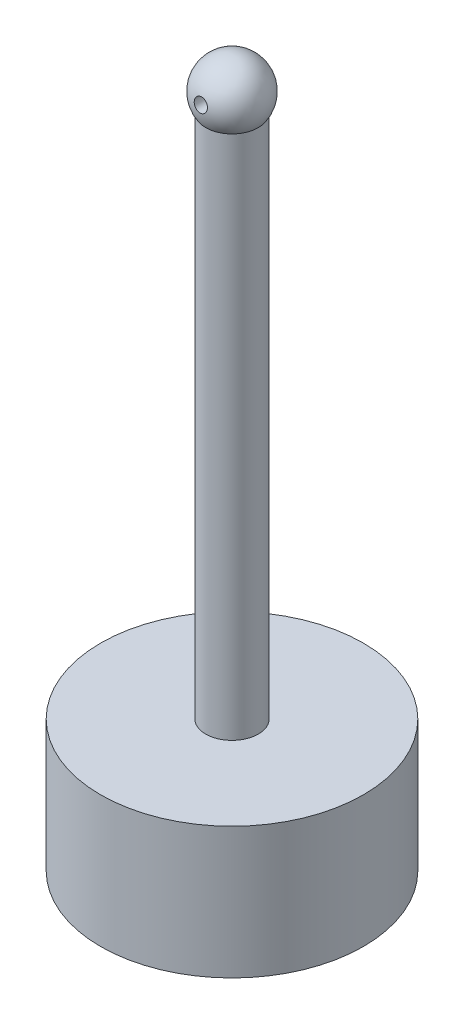
ISO-10303-21;
HEADER;
FILE_DESCRIPTION(('STEP AP214'),'2;1');
FILE_NAME('part.step','',(''),(''),'','','');
FILE_SCHEMA(('AUTOMOTIVE_DESIGN { 1 0 10303 214 1 1 1 1 }'));
ENDSEC;
DATA;
#1=APPLICATION_CONTEXT('core data for automotive mechanical design processes');
#2=APPLICATION_PROTOCOL_DEFINITION('international standard','automotive_design',2000,#1);
#3=PRODUCT_CONTEXT('',#1,'mechanical');
#4=PRODUCT('Part','Part','',(#3));
#5=PRODUCT_RELATED_PRODUCT_CATEGORY('part','',(#4));
#6=PRODUCT_DEFINITION_FORMATION('','',#4);
#7=PRODUCT_DEFINITION_CONTEXT('part definition',#1,'design');
#8=PRODUCT_DEFINITION('design','',#6,#7);
#9=PRODUCT_DEFINITION_SHAPE('','',#8);
#10=(LENGTH_UNIT() NAMED_UNIT(*) SI_UNIT(.MILLI.,.METRE.));
#11=(NAMED_UNIT(*) PLANE_ANGLE_UNIT() SI_UNIT($,.RADIAN.));
#12=(NAMED_UNIT(*) SI_UNIT($,.STERADIAN.) SOLID_ANGLE_UNIT());
#13=UNCERTAINTY_MEASURE_WITH_UNIT(LENGTH_MEASURE(1.E-05),#10,'distance_accuracy_value','');
#14=(GEOMETRIC_REPRESENTATION_CONTEXT(3) GLOBAL_UNCERTAINTY_ASSIGNED_CONTEXT((#13)) GLOBAL_UNIT_ASSIGNED_CONTEXT((#10,
#11,#12)) REPRESENTATION_CONTEXT('',''));
#15=CARTESIAN_POINT('',(0.,0.,0.));
#16=DIRECTION('',(0.,0.,1.));
#17=DIRECTION('',(1.,0.,0.));
#18=AXIS2_PLACEMENT_3D('',#15,#16,#17);
#19=CARTESIAN_POINT('',(0.,2568.17122246381,0.));
#20=DIRECTION('',(0.,1.,0.));
#21=DIRECTION('',(1.,0.,0.));
#22=AXIS2_PLACEMENT_3D('',#19,#20,#21);
#23=SPHERICAL_SURFACE('',#22,122.029891086168);
#24=CARTESIAN_POINT('',(0.,2498.23343354751,0.));
#25=DIRECTION('',(0.,0.999999999999998,0.));
#26=DIRECTION('',(0.,0.,1.));
#27=AXIS2_PLACEMENT_3D('',#24,#25,#26);
#28=CIRCLE('',#27,100.);
#29=CARTESIAN_POINT('',(0.,2498.23343354751,100.));
#30=VERTEX_POINT('',#29);
#31=EDGE_CURVE('E10',#30,#30,#28,.T.);
#32=ORIENTED_EDGE('',*,*,#31,.T.);
#33=EDGE_LOOP('',(#32));
#34=FACE_BOUND('',#33,.T.);
#35=CARTESIAN_POINT('',(-18.0432192767881,2565.21995179091,120.652503322753));
#36=CARTESIAN_POINT('',(-17.5593675486618,2564.71543328241,120.712522142687));
#37=CARTESIAN_POINT('',(-17.0542574905268,2564.23113976605,120.770090122937));
#38=CARTESIAN_POINT('',(-16.0047309310861,2563.30618718758,120.87996772107));
#39=CARTESIAN_POINT('',(-15.4603048199151,2562.86553885633,120.932276045831));
#40=CARTESIAN_POINT('',(-14.3354952907405,2562.03082488183,121.031305502747));
#41=CARTESIAN_POINT('',(-13.7550751582116,2561.63680803541,121.078020782727));
#42=CARTESIAN_POINT('',(-12.5628855367983,2560.89877934475,121.165478414951));
#43=CARTESIAN_POINT('',(-11.9511179997832,2560.55476439222,121.206221138473));
#44=CARTESIAN_POINT('',(-10.7006420049655,2559.91930651498,121.281448132893));
#45=CARTESIAN_POINT('',(-10.0619387864986,2559.62785342398,121.315933614049));
#46=CARTESIAN_POINT('',(-8.76200165065304,2559.09958743673,121.378417725583));
#47=CARTESIAN_POINT('',(-8.10076738507192,2558.86277538535,121.406416255658));
#48=CARTESIAN_POINT('',(-6.76065817125818,2558.44560826033,121.455725331318));
#49=CARTESIAN_POINT('',(-6.08178761005979,2558.26523928936,121.477037523206));
#50=CARTESIAN_POINT('',(-4.71111020291278,2557.96222427755,121.512835014058));
#51=CARTESIAN_POINT('',(-4.01930344452943,2557.83957784613,121.527320359214));
#52=CARTESIAN_POINT('',(-2.63036790872094,2557.65327845591,121.54932147659));
#53=CARTESIAN_POINT('',(-1.93326944830853,2557.58940252448,121.556863591177));
#54=CARTESIAN_POINT('',(-0.536131263268105,2557.52031645951,121.56502082721));
#55=CARTESIAN_POINT('',(0.16390845656835,2557.51510623045,121.565635959936));
#56=CARTESIAN_POINT('',(1.56194634926557,2557.56339074981,121.559934922455));
#57=CARTESIAN_POINT('',(2.25994447892242,2557.61688673169,121.553618606614));
#58=CARTESIAN_POINT('',(3.64890372527966,2557.78218810302,121.534098146146));
#59=CARTESIAN_POINT('',(4.33986484687952,2557.89399345187,121.520894006315));
#60=CARTESIAN_POINT('',(5.70850348452919,2558.17481205051,121.487721302184));
#61=CARTESIAN_POINT('',(6.38620407397663,2558.34371441939,121.467765848699));
#62=CARTESIAN_POINT('',(7.72489430424842,2558.73753123251,121.421221919458));
#63=CARTESIAN_POINT('',(8.38588397732627,2558.96244556863,121.394633456506));
#64=CARTESIAN_POINT('',(9.68649277821817,2559.46663432533,121.335005907096));
#65=CARTESIAN_POINT('',(10.3261118994395,2559.74590876266,121.301966818647));
#66=CARTESIAN_POINT('',(11.5794916151916,2560.35677558558,121.229664077206));
#67=CARTESIAN_POINT('',(12.1932521422995,2560.68836810756,121.190400407985));
#68=CARTESIAN_POINT('',(13.3921014790321,2561.4023351902,121.105812557731));
#69=CARTESIAN_POINT('',(13.9771161496911,2561.78483250098,121.060473725387));
#70=CARTESIAN_POINT('',(15.1127752133339,2562.59719774416,120.964120014855));
#71=CARTESIAN_POINT('',(15.6634195779036,2563.02706571573,120.913105131975));
#72=CARTESIAN_POINT('',(16.7265348696274,2563.9310754608,120.805745949197));
#73=CARTESIAN_POINT('',(17.2390051442195,2564.40521799082,120.749401558232));
#74=CARTESIAN_POINT('',(18.2222400110106,2565.39436959453,120.631766687878));
#75=CARTESIAN_POINT('',(18.693004425244,2565.90937884257,120.570476187386));
#76=CARTESIAN_POINT('',(19.5922243887948,2566.97970176305,120.442994017191));
#77=CARTESIAN_POINT('',(20.0204177803516,2567.53523254414,120.376775900995));
#78=CARTESIAN_POINT('',(20.8284256665978,2568.67994784338,120.240208260145));
#79=CARTESIAN_POINT('',(21.2082400006927,2569.26913247324,120.169858721776));
#80=CARTESIAN_POINT('',(21.9169155114928,2570.47698183128,120.025506077028));
#81=CARTESIAN_POINT('',(22.245775224914,2571.0956474054,119.951502865805));
#82=CARTESIAN_POINT('',(22.8503071708509,2572.35807051904,119.800348895419));
#83=CARTESIAN_POINT('',(23.125979179581,2573.00182816411,119.723198123014));
#84=CARTESIAN_POINT('',(23.6239769163186,2574.31437217636,119.565739344046));
#85=CARTESIAN_POINT('',(23.8459262088705,2574.98329923742,119.485413401293));
#86=CARTESIAN_POINT('',(24.2325314087254,2576.33726001248,119.322658653403));
#87=CARTESIAN_POINT('',(24.3971870596266,2577.02229379855,119.240229838855));
#88=CARTESIAN_POINT('',(24.6681007510405,2578.40364741125,119.073838096113));
#89=CARTESIAN_POINT('',(24.7743573082847,2579.09996752408,118.989875129009));
#90=CARTESIAN_POINT('',(24.927756488301,2580.49897482228,118.821000328739));
#91=CARTESIAN_POINT('',(24.9748989692401,2581.20166202292,118.736088493299));
#92=CARTESIAN_POINT('',(25.009844499885,2582.61195634843,118.565486166993));
#93=CARTESIAN_POINT('',(24.997352203525,2583.31957059359,118.479793902819));
#94=CARTESIAN_POINT('',(24.9124407012151,2584.73122639777,118.308656524195));
#95=CARTESIAN_POINT('',(24.8400212669149,2585.43526794316,118.223211410689));
#96=CARTESIAN_POINT('',(24.6357507083108,2586.83479075638,118.053177232188));
#97=CARTESIAN_POINT('',(24.5038988348375,2587.53027191618,117.968588177999));
#98=CARTESIAN_POINT('',(24.1816643511118,2588.90772090249,117.800876025069));
#99=CARTESIAN_POINT('',(23.9912817765551,2589.58968873723,117.717752925433));
#100=CARTESIAN_POINT('',(23.5530978922276,2590.93583377831,117.55350518137));
#101=CARTESIAN_POINT('',(23.3052469735394,2591.59999505752,117.472382330958));
#102=CARTESIAN_POINT('',(22.7539197323655,2592.90514999279,117.31280619947));
#103=CARTESIAN_POINT('',(22.4504433275293,2593.54614361455,117.234352922345));
#104=CARTESIAN_POINT('',(21.7899626695606,2594.80033711545,117.080699969027));
#105=CARTESIAN_POINT('',(21.4329588379389,2595.41353721342,117.005500267221));
#106=CARTESIAN_POINT('',(20.6679000737382,2596.60770078243,116.858919761533));
#107=CARTESIAN_POINT('',(20.2598453268669,2597.18866437073,116.787538943761));
#108=CARTESIAN_POINT('',(19.3971804383724,2598.31197248311,116.649403113007));
#109=CARTESIAN_POINT('',(18.9427532849795,2598.85445549822,116.58263153746));
#110=CARTESIAN_POINT('',(17.9892372919571,2599.89926238892,116.453928584802));
#111=CARTESIAN_POINT('',(17.4901485262185,2600.40158633094,116.391997199685));
#112=CARTESIAN_POINT('',(16.4508338242067,2601.36236785603,116.273456010125));
#113=CARTESIAN_POINT('',(15.9106089575461,2601.82082657896,116.216846067401));
#114=CARTESIAN_POINT('',(14.7928408354136,2602.69049316018,116.109389970985));
#115=CARTESIAN_POINT('',(14.2152977728871,2603.10170126274,116.058543787496));
#116=CARTESIAN_POINT('',(13.0311413568527,2603.87111800384,115.963349734778));
#117=CARTESIAN_POINT('',(12.4247573792034,2604.22967441299,115.918959245631));
#118=CARTESIAN_POINT('',(11.1835562075918,2604.89450331759,115.836610641709));
#119=CARTESIAN_POINT('',(10.5487391333217,2605.2007760331,115.798652499861));
#120=CARTESIAN_POINT('',(9.2552246284625,2605.75874225146,115.729472480618));
#121=CARTESIAN_POINT('',(8.59652797191249,2606.01043752155,115.698250385106));
#122=CARTESIAN_POINT('',(7.25996550948709,2606.45737084011,115.642792083656));
#123=CARTESIAN_POINT('',(6.58209978508714,2606.6526091285,115.618555848029));
#124=CARTESIAN_POINT('',(5.2168456185483,2606.9840023313,115.577408661085));
#125=CARTESIAN_POINT('',(4.52955584834893,2607.12055768981,115.560448063293));
#126=CARTESIAN_POINT('',(3.14580492102509,2607.33552100776,115.533745568516));
#127=CARTESIAN_POINT('',(2.44934380857262,2607.41392925031,115.524003636382));
#128=CARTESIAN_POINT('',(1.05225036448843,2607.51201078123,115.511816983512));
#129=CARTESIAN_POINT('',(0.351618126937429,2607.53168538936,115.509372098809));
#130=CARTESIAN_POINT('',(-1.04881239127217,2607.51215593088,115.511798792589));
#131=CARTESIAN_POINT('',(-1.74861067300749,2607.47295194037,115.516670361615));
#132=CARTESIAN_POINT('',(-3.13978968613947,2607.3362121141,115.533659246523));
#133=CARTESIAN_POINT('',(-3.83119192916193,2607.23889168573,115.545749805343));
#134=CARTESIAN_POINT('',(-5.20328033287274,2606.98682065302,115.577057901585));
#135=CARTESIAN_POINT('',(-5.88396652796882,2606.83207023314,115.596275416119));
#136=CARTESIAN_POINT('',(-7.22980144769515,2606.46628589758,115.641684474535));
#137=CARTESIAN_POINT('',(-7.8949502373459,2606.25525221749,115.667875989226));
#138=CARTESIAN_POINT('',(-9.20502359159855,2605.77845726793,115.727025939732));
#139=CARTESIAN_POINT('',(-9.84994811297057,2605.51269588148,115.759984390009));
#140=CARTESIAN_POINT('',(-11.1158672618488,2604.92801663481,115.832456334756));
#141=CARTESIAN_POINT('',(-11.736829771532,2604.60903028619,115.871978274628));
#142=CARTESIAN_POINT('',(-12.949596555246,2603.92047651409,115.957238450586));
#143=CARTESIAN_POINT('',(-13.5414008306574,2603.550909093,116.002976686378));
#144=CARTESIAN_POINT('',(-14.691751414592,2602.76387030226,116.100316692785));
#145=CARTESIAN_POINT('',(-15.2502970979519,2602.34639803257,116.151918573566));
#146=CARTESIAN_POINT('',(-16.330267425742,2601.46656549637,116.260590422944));
#147=CARTESIAN_POINT('',(-16.8516919060858,2601.00420503145,116.317660415709));
#148=CARTESIAN_POINT('',(-17.8566717715983,2600.03518370395,116.437172492605));
#149=CARTESIAN_POINT('',(-18.3399974242679,2599.52828808377,116.499643012878));
#150=CARTESIAN_POINT('',(-19.2621752394435,2598.47609073167,116.629205039442));
#151=CARTESIAN_POINT('',(-19.7010272656551,2597.93078888205,116.696296559893));
#152=CARTESIAN_POINT('',(-20.5312766683457,2596.80565033786,116.834601662941));
#153=CARTESIAN_POINT('',(-20.9226725750813,2596.22581257452,116.905815373104));
#154=CARTESIAN_POINT('',(-21.6553430113817,2595.03572230039,117.051837679961));
#155=CARTESIAN_POINT('',(-21.9966173077945,2594.42546964813,117.126646293376));
#156=CARTESIAN_POINT('',(-22.6290642547674,2593.17425422202,117.279874949308));
#157=CARTESIAN_POINT('',(-22.9198499503284,2592.53309858912,117.358317506847));
#158=CARTESIAN_POINT('',(-23.4462499537283,2591.22882849294,117.51772377006));
#159=CARTESIAN_POINT('',(-23.6818639910587,2590.56571392202,117.598687488093));
#160=CARTESIAN_POINT('',(-24.0963230094774,2589.22221659936,117.762549555038));
#161=CARTESIAN_POINT('',(-24.275168574815,2588.54183402541,117.84544788403));
#162=CARTESIAN_POINT('',(-24.5748866657495,2587.16858034,118.012586448823));
#163=CARTESIAN_POINT('',(-24.6957590806949,2586.47570920469,118.096826687184));
#164=CARTESIAN_POINT('',(-24.8792300237313,2585.07841172935,118.266528378569));
#165=CARTESIAN_POINT('',(-24.9414965895246,2584.37394229229,118.351994037101));
#166=CARTESIAN_POINT('',(-25.0061487981033,2582.96227404773,118.523070348929));
#167=CARTESIAN_POINT('',(-25.0085339566146,2582.2550752182,118.608681003392));
#168=CARTESIAN_POINT('',(-24.9533931541712,2580.84277106551,118.779464471363));
#169=CARTESIAN_POINT('',(-24.8958511922723,2580.13766635193,118.864637161829));
#170=CARTESIAN_POINT('',(-24.7212176867066,2578.73475266605,119.033921088046));
#171=CARTESIAN_POINT('',(-24.6041270741454,2578.03694357986,119.118032340373));
#172=CARTESIAN_POINT('',(-24.3108751877274,2576.65209874534,119.284782647002));
#173=CARTESIAN_POINT('',(-24.1345891464992,2575.96508898769,119.367418200221));
#174=CARTESIAN_POINT('',(-23.7241987167979,2574.60824034062,119.530458783744));
#175=CARTESIAN_POINT('',(-23.4900904372673,2573.93840261011,119.610863663533));
#176=CARTESIAN_POINT('',(-22.9659473386179,2572.62147731363,119.76878846047));
#177=CARTESIAN_POINT('',(-22.6759745153039,2571.97436546011,119.846311463063));
#178=CARTESIAN_POINT('',(-22.0420550300782,2570.7069983508,119.997998903028));
#179=CARTESIAN_POINT('',(-21.6981225387779,2570.08673609832,120.07216421561));
#180=CARTESIAN_POINT('',(-20.8598948725368,2568.71600066468,120.23591995207));
#181=CARTESIAN_POINT('',(-20.3499566432051,2567.97488927723,120.324352507404));
#182=CARTESIAN_POINT('',(-19.2528099097766,2566.55134788649,120.494042854571));
#183=CARTESIAN_POINT('',(-18.6656014766138,2565.86891782932,120.575300652989));
#184=CARTESIAN_POINT('',(-18.0432192767881,2565.21995179091,120.652503322753));
#185=B_SPLINE_CURVE_WITH_KNOTS('',3,(#35,#36,#37,#38,#39,#40,#41,#42,#43,#44,#45,#46,#47,#48,
#49,#50,#51,#52,#53,#54,#55,#56,#57,#58,#59,#60,#61,#62,#63,#64,#65,#66,#67,#68,#69,#70,#71,#72,
#73,#74,#75,#76,#77,#78,#79,#80,#81,#82,#83,#84,#85,#86,#87,#88,#89,#90,#91,#92,#93,#94,#95,#96,
#97,#98,#99,#100,#101,#102,#103,#104,#105,#106,#107,#108,#109,#110,#111,#112,#113,#114,#115,
#116,#117,#118,#119,#120,#121,#122,#123,#124,#125,#126,#127,#128,#129,#130,#131,#132,#133,#134,
#135,#136,#137,#138,#139,#140,#141,#142,#143,#144,#145,#146,#147,#148,#149,#150,#151,#152,#153,
#154,#155,#156,#157,#158,#159,#160,#161,#162,#163,#164,#165,#166,#167,#168,#169,#170,#171,#172,
#173,#174,#175,#176,#177,#178,#179,#180,#181,#182,#183,#184),.UNSPECIFIED.,.T.,.F.,(4,2,2,2,2,2,
2,2,2,2,2,2,2,2,2,2,2,2,2,2,2,2,2,2,2,2,2,2,2,2,2,2,2,2,2,2,2,2,2,2,2,2,2,2,2,2,2,2,2,2,2,2,2,2,
2,2,2,2,2,2,2,2,2,2,2,2,2,2,2,2,2,2,2,2,4),(0.,2.10404484756952,4.2086057305105,
6.31534978373943,8.42196281802293,10.5281679621254,12.634405671023,14.7401243766279,
16.8458288337557,18.9435109973664,21.0411897449974,23.1389125668951,25.2366339281723,
27.3303047507174,29.42397153199,31.5176389591452,33.6113118449331,35.7101280509151,
37.8089459919719,39.9077998027748,42.006662569299,44.117739586023,46.2288236102921,
48.3399682481693,50.4511217684367,52.5766656532962,54.7022190503137,56.8278264314042,
58.9534389124752,61.0895895518729,63.2257483310389,65.3619340380826,67.498118442352,
69.636153795288,71.7741923135018,73.9122139962571,76.0502279017626,78.1801093712463,
80.3099873169947,82.4398099009853,84.5696214740845,86.6846629817107,88.7996955866792,
90.9146596956139,93.0296148165414,95.12989931921,97.2301735955429,99.3304006778295,
101.430625045545,103.523112874477,105.615593983355,107.708066334109,109.800543157269,
111.895733583922,113.990923911358,116.086153609751,118.181392569089,120.288427817353,
122.395469522668,124.50257646762,126.609693213943,128.732307643796,130.854932480678,
132.977535471242,135.100142513136,137.234701577956,139.369277905426,141.504424325291,
143.639537360928,145.779179162589,147.918964987362,150.056389718009,152.19325406582,
154.89970562272,157.606154695111),.UNSPECIFIED.);
#186=CARTESIAN_POINT('',(-18.0432192767881,2565.21995179091,120.652503322753));
#187=VERTEX_POINT('',#186);
#188=EDGE_CURVE('E64',#187,#187,#185,.T.);
#189=ORIENTED_EDGE('',*,*,#188,.F.);
#190=EDGE_LOOP('',(#189));
#191=FACE_BOUND('',#190,.T.);
#192=CARTESIAN_POINT('',(-18.0432192767881,2565.21995179091,-120.652503322753));
#193=CARTESIAN_POINT('',(-18.5319061895835,2565.72949733367,-120.591886490275));
#194=CARTESIAN_POINT('',(-18.9987941193725,2566.25955179517,-120.528784149022));
#195=CARTESIAN_POINT('',(-19.8859744136449,2567.35708451066,-120.3980138987));
#196=CARTESIAN_POINT('',(-20.3062536355464,2567.9245732487,-120.330344710492));
#197=CARTESIAN_POINT('',(-21.09758036842,2569.09338650886,-120.190846630914));
#198=CARTESIAN_POINT('',(-21.4685691737407,2569.69475018453,-120.119012923162));
#199=CARTESIAN_POINT('',(-22.1581552410256,2570.92632607122,-119.971760545563));
#200=CARTESIAN_POINT('',(-22.4767562052426,2571.55653623963,-119.896342129534));
#201=CARTESIAN_POINT('',(-23.0592045634784,2572.84086404711,-119.74249288117));
#202=CARTESIAN_POINT('',(-23.3230908341298,2573.4949643201,-119.664064234988));
#203=CARTESIAN_POINT('',(-23.7946059133438,2574.82284884111,-119.504684732986));
#204=CARTESIAN_POINT('',(-24.0022338139599,2575.49663340661,-119.423733836483));
#205=CARTESIAN_POINT('',(-24.3597758175698,2576.85892022812,-119.259892849851));
#206=CARTESIAN_POINT('',(-24.5097051350964,2577.54741855363,-119.177003277056));
#207=CARTESIAN_POINT('',(-24.7509206982353,2578.93444409765,-119.00983907633));
#208=CARTESIAN_POINT('',(-24.8422070077754,2579.63297130522,-118.92556444991));
#209=CARTESIAN_POINT('',(-24.965780117809,2581.03801169323,-118.755869272259));
#210=CARTESIAN_POINT('',(-24.9978239458759,2581.74454585649,-118.670445442902));
#211=CARTESIAN_POINT('',(-25.0019617539314,2583.1577666991,-118.499393839132));
#212=CARTESIAN_POINT('',(-24.9740555104654,2583.86445337901,-118.413766063961));
#213=CARTESIAN_POINT('',(-24.8584840598299,2585.2730140678,-118.242908830179));
#214=CARTESIAN_POINT('',(-24.7708154049617,2585.97488779666,-118.157679394834));
#215=CARTESIAN_POINT('',(-24.5363151130631,2587.36880582282,-117.98823259464));
#216=CARTESIAN_POINT('',(-24.3894834677216,2588.06085011874,-117.904015229933));
#217=CARTESIAN_POINT('',(-24.0373570011975,2589.43136957091,-117.737055966757));
#218=CARTESIAN_POINT('',(-23.8319623384842,2590.10981941814,-117.654316846689));
#219=CARTESIAN_POINT('',(-23.3642202103055,2591.4470734137,-117.491066538902));
#220=CARTESIAN_POINT('',(-23.1018726338911,2592.10587752376,-117.410555355523));
#221=CARTESIAN_POINT('',(-22.5220319568448,2593.39910332694,-117.252355360074));
#222=CARTESIAN_POINT('',(-22.2045391832381,2594.03352516464,-117.174666531269));
#223=CARTESIAN_POINT('',(-21.5166027597688,2595.27340769461,-117.022690497712));
#224=CARTESIAN_POINT('',(-21.1461592754564,2595.87886847742,-116.948403282325));
#225=CARTESIAN_POINT('',(-20.3560804377527,2597.05467031726,-116.804007341071));
#226=CARTESIAN_POINT('',(-19.9365953285637,2597.6251108767,-116.733886796646));
#227=CARTESIAN_POINT('',(-19.0504701824606,2598.72868248338,-116.59811712947));
#228=CARTESIAN_POINT('',(-18.5838301962115,2599.26181357071,-116.532468001915));
#229=CARTESIAN_POINT('',(-17.6066788622592,2600.28684608986,-116.40614783331));
#230=CARTESIAN_POINT('',(-17.0961686238043,2600.77874856351,-116.345476666468));
#231=CARTESIAN_POINT('',(-16.0348730792565,2601.71770506799,-116.229583221944));
#232=CARTESIAN_POINT('',(-15.4840879769058,2602.16475932567,-116.174360916701));
#233=CARTESIAN_POINT('',(-14.3498961493034,2603.00791856394,-116.070143253399));
#234=CARTESIAN_POINT('',(-13.7667270151626,2603.4043384101,-116.021109438033));
#235=CARTESIAN_POINT('',(-12.5686354505829,2604.14670133702,-115.929234346255));
#236=CARTESIAN_POINT('',(-11.9537131422265,2604.49264461183,-115.886393046036));
#237=CARTESIAN_POINT('',(-10.6965160659388,2605.13146707179,-115.807244562531));
#238=CARTESIAN_POINT('',(-10.0542421509192,2605.42434791011,-115.770937175679));
#239=CARTESIAN_POINT('',(-8.74693038926791,2605.95486179275,-115.705146075274));
#240=CARTESIAN_POINT('',(-8.08189264752608,2606.1924950916,-115.675662330284));
#241=CARTESIAN_POINT('',(-6.73870764973599,2606.60921588666,-115.623943682374));
#242=CARTESIAN_POINT('',(-6.0606893333349,2606.78871277739,-115.601658093493));
#243=CARTESIAN_POINT('',(-4.69178352399177,2607.09014754836,-115.564225826869));
#244=CARTESIAN_POINT('',(-4.00089609447439,2607.2120857122,-115.549079113951));
#245=CARTESIAN_POINT('',(-2.61121781060879,2607.3974877984,-115.526046780402));
#246=CARTESIAN_POINT('',(-1.91242716291791,2607.46095324619,-115.518160970352));
#247=CARTESIAN_POINT('',(-0.51194029861873,2607.52893894653,-115.509713441195));
#248=CARTESIAN_POINT('',(0.189755912368956,2607.53345931307,-115.509151707926));
#249=CARTESIAN_POINT('',(1.58786919457757,2607.48363363849,-115.515342861666));
#250=CARTESIAN_POINT('',(2.28429582943069,2607.42955143716,-115.522062964482));
#251=CARTESIAN_POINT('',(3.67007687116462,2607.26333935655,-115.542712266077));
#252=CARTESIAN_POINT('',(4.35943130400706,2607.15120969042,-115.556641438383));
#253=CARTESIAN_POINT('',(5.7261691506381,2606.8697364713,-115.591597541503));
#254=CARTESIAN_POINT('',(6.40355264844816,2606.70039332003,-115.612624422479));
#255=CARTESIAN_POINT('',(7.74155952508275,2606.305746431,-115.66160884107));
#256=CARTESIAN_POINT('',(8.40218287798663,2606.08044260668,-115.689566389403));
#257=CARTESIAN_POINT('',(9.70223744215051,2605.57544765884,-115.752202075743));
#258=CARTESIAN_POINT('',(10.3416612216803,2605.29573769377,-115.786882541969));
#259=CARTESIAN_POINT('',(11.5945891429711,2604.68403319888,-115.862685596371));
#260=CARTESIAN_POINT('',(12.2080933024213,2604.35203870474,-115.903808180152));
#261=CARTESIAN_POINT('',(13.4049128923475,2603.6381810159,-115.992176163876));
#262=CARTESIAN_POINT('',(13.988227910789,2603.25631714081,-116.039421647356));
#263=CARTESIAN_POINT('',(15.1206217792781,2602.44548927424,-116.139671118974));
#264=CARTESIAN_POINT('',(15.6697004877272,2602.01652508798,-116.192675130927));
#265=CARTESIAN_POINT('',(16.7324865882606,2601.11233331544,-116.304315244841));
#266=CARTESIAN_POINT('',(17.2460042201674,2600.63688598243,-116.362978079297));
#267=CARTESIAN_POINT('',(18.2311070832035,2599.64496232301,-116.485265511409));
#268=CARTESIAN_POINT('',(18.7026922069262,2599.1284858915,-116.548890121775));
#269=CARTESIAN_POINT('',(19.6007160983215,2598.05818329712,-116.680624649165));
#270=CARTESIAN_POINT('',(20.0271536157584,2597.50435610062,-116.748734690316));
#271=CARTESIAN_POINT('',(20.8319718879659,2596.36329597619,-116.888932819723));
#272=CARTESIAN_POINT('',(21.2103524126404,2595.77606288832,-116.961020927023));
#273=CARTESIAN_POINT('',(21.9190715363681,2594.56795159136,-117.10918344697));
#274=CARTESIAN_POINT('',(22.2490408197296,2593.94685979464,-117.185283032866));
#275=CARTESIAN_POINT('',(22.8553840012632,2592.67939713834,-117.340422137798));
#276=CARTESIAN_POINT('',(23.1317576551711,2592.03302616356,-117.419461670232));
#277=CARTESIAN_POINT('',(23.6290450455242,2590.71955516712,-117.579908209445));
#278=CARTESIAN_POINT('',(23.8499571674057,2590.05245454263,-117.661315285069));
#279=CARTESIAN_POINT('',(24.2348212883467,2588.70223485672,-117.825909153431));
#280=CARTESIAN_POINT('',(24.3987730961742,2588.01911574154,-117.909095952143));
#281=CARTESIAN_POINT('',(24.669457894177,2586.63732967478,-118.077181970034));
#282=CARTESIAN_POINT('',(24.7758260292944,2585.93859213518,-118.162088651795));
#283=CARTESIAN_POINT('',(24.9290420612337,2584.53469205649,-118.3324972762));
#284=CARTESIAN_POINT('',(24.9758896907026,2583.82952948854,-118.417999221517));
#285=CARTESIAN_POINT('',(25.0097422671572,2582.41775443372,-118.588993241758));
#286=CARTESIAN_POINT('',(24.9967461037289,2581.71114192018,-118.67448531647));
#287=CARTESIAN_POINT('',(24.9109908049516,2580.30147798301,-118.844855343181));
#288=CARTESIAN_POINT('',(24.838231640744,2579.59842656111,-118.929733294884));
#289=CARTESIAN_POINT('',(24.6331772652107,2578.19908940478,-119.098493822926));
#290=CARTESIAN_POINT('',(24.5007315705539,2577.50282534406,-119.182373329892));
#291=CARTESIAN_POINT('',(24.1771608228544,2576.12384601218,-119.34832822217));
#292=CARTESIAN_POINT('',(23.9860356241362,2575.44113077466,-119.430403603003));
#293=CARTESIAN_POINT('',(23.5464104593874,2574.09413968027,-119.592175242451));
#294=CARTESIAN_POINT('',(23.2979106039595,2573.42986378786,-119.671871505651));
#295=CARTESIAN_POINT('',(22.7452418995387,2572.12452894763,-119.828327657405));
#296=CARTESIAN_POINT('',(22.4410731966969,2571.48346993886,-119.905087553666));
#297=CARTESIAN_POINT('',(21.7798891045179,2570.23056945439,-120.054971086232));
#298=CARTESIAN_POINT('',(21.4229902210371,2569.61866740198,-120.128102275924));
#299=CARTESIAN_POINT('',(20.6583289728685,2568.4270244745,-120.270397716797));
#300=CARTESIAN_POINT('',(20.2505666360008,2567.84728358184,-120.339561970147));
#301=CARTESIAN_POINT('',(19.3870305389434,2566.72419957259,-120.473439876935));
#302=CARTESIAN_POINT('',(18.9312576167535,2566.18085582099,-120.53815360802));
#303=CARTESIAN_POINT('',(17.9748981664765,2565.13454451202,-120.662679230442));
#304=CARTESIAN_POINT('',(17.4743118436369,2564.63157676976,-120.722491144227));
#305=CARTESIAN_POINT('',(16.4348975750479,2563.67252688696,-120.836462068466));
#306=CARTESIAN_POINT('',(15.8963084467286,2563.21618956549,-120.890651873532));
#307=CARTESIAN_POINT('',(14.7821361505302,2562.3504531029,-120.993395547503));
#308=CARTESIAN_POINT('',(14.2065531037968,2561.94105380809,-121.041949434864));
#309=CARTESIAN_POINT('',(13.0224951480534,2561.17223473826,-121.13308153808));
#310=CARTESIAN_POINT('',(12.4140211217033,2560.81281362297,-121.175659914183));
#311=CARTESIAN_POINT('',(11.1685161694618,2560.14661639833,-121.254544601104));
#312=CARTESIAN_POINT('',(10.5314853726989,2559.83984005097,-121.290850940279));
#313=CARTESIAN_POINT('',(9.23788255960399,2559.2831384146,-121.356711098939));
#314=CARTESIAN_POINT('',(8.58147372499453,2559.03283914662,-121.386309344129));
#315=CARTESIAN_POINT('',(7.2496838333359,2558.58829263632,-121.438862659353));
#316=CARTESIAN_POINT('',(6.57430285845008,2558.39404515131,-121.461817758152));
#317=CARTESIAN_POINT('',(5.20944594574149,2558.06306056265,-121.500923876212));
#318=CARTESIAN_POINT('',(4.5199709316273,2557.92631970268,-121.517075339888));
#319=CARTESIAN_POINT('',(3.13183338494975,2557.71135260127,-121.542463776198));
#320=CARTESIAN_POINT('',(2.43317088490386,2557.6331261528,-121.551700773299));
#321=CARTESIAN_POINT('',(1.03525662009649,2557.53602103778,-121.563166646081));
#322=CARTESIAN_POINT('',(0.336025990675025,2557.51684205202,-121.565430985164));
#323=CARTESIAN_POINT('',(-1.06157334717523,2557.53712476974,-121.563036198314));
#324=CARTESIAN_POINT('',(-1.75994205546044,2557.57658648299,-121.558377071229));
#325=CARTESIAN_POINT('',(-3.15101086067487,2557.71387493154,-121.542165515851));
#326=CARTESIAN_POINT('',(-3.84370952266175,2557.81171600481,-121.53061139415));
#327=CARTESIAN_POINT('',(-5.21832197021794,2558.06504734809,-121.500688517875));
#328=CARTESIAN_POINT('',(-5.90023592430333,2558.22053671638,-121.482319869891));
#329=CARTESIAN_POINT('',(-7.24802027936629,2558.58789865131,-121.438908316373));
#330=CARTESIAN_POINT('',(-7.91390056702255,2558.79973544889,-121.413869644922));
#331=CARTESIAN_POINT('',(-9.225398968083,2559.27829082567,-121.357283288713));
#332=CARTESIAN_POINT('',(-9.87101574178672,2559.54501302479,-121.325735174631));
#333=CARTESIAN_POINT('',(-11.1367046782216,2560.13105789401,-121.25638480714));
#334=CARTESIAN_POINT('',(-11.7568043805617,2560.45032189185,-121.218589529595));
#335=CARTESIAN_POINT('',(-12.9676872826183,2561.13920983167,-121.136992906658));
#336=CARTESIAN_POINT('',(-13.5584781800173,2561.50882045402,-121.093193149781));
#337=CARTESIAN_POINT('',(-14.8394215308755,2562.38669280773,-120.989099169381));
#338=CARTESIAN_POINT('',(-15.521059733169,2562.9072709301,-120.927330667314));
#339=CARTESIAN_POINT('',(-16.8268744804904,2564.01517863089,-120.795759072597));
#340=CARTESIAN_POINT('',(-17.4510511139674,2564.60250810656,-120.725955992315));
#341=CARTESIAN_POINT('',(-18.0432192767881,2565.21995179091,-120.652503322753));
#342=B_SPLINE_CURVE_WITH_KNOTS('',3,(#192,#193,#194,#195,#196,#197,#198,#199,#200,#201,#202,
#203,#204,#205,#206,#207,#208,#209,#210,#211,#212,#213,#214,#215,#216,#217,#218,#219,#220,#221,
#222,#223,#224,#225,#226,#227,#228,#229,#230,#231,#232,#233,#234,#235,#236,#237,#238,#239,#240,
#241,#242,#243,#244,#245,#246,#247,#248,#249,#250,#251,#252,#253,#254,#255,#256,#257,#258,#259,
#260,#261,#262,#263,#264,#265,#266,#267,#268,#269,#270,#271,#272,#273,#274,#275,#276,#277,#278,
#279,#280,#281,#282,#283,#284,#285,#286,#287,#288,#289,#290,#291,#292,#293,#294,#295,#296,#297,
#298,#299,#300,#301,#302,#303,#304,#305,#306,#307,#308,#309,#310,#311,#312,#313,#314,#315,#316,
#317,#318,#319,#320,#321,#322,#323,#324,#325,#326,#327,#328,#329,#330,#331,#332,#333,#334,#335,
#336,#337,#338,#339,#340,#341),.UNSPECIFIED.,.T.,.F.,(4,2,2,2,2,2,2,2,2,2,2,2,2,2,2,2,2,2,2,2,2,
2,2,2,2,2,2,2,2,2,2,2,2,2,2,2,2,2,2,2,2,2,2,2,2,2,2,2,2,2,2,2,2,2,2,2,2,2,2,2,2,2,2,2,2,2,2,2,2,
2,2,2,2,2,4),(0.,2.12506650874341,4.25073072181989,6.37890436292262,8.50692754112772,
10.6334334660881,12.7599737084104,14.8859528187302,17.0119296114753,19.1466065380322,
21.281291421287,23.4160994651216,25.5509078088473,27.6893776821893,29.827851721492,
31.9663130795328,34.1047677518295,36.2368347381324,38.3688994336841,40.5009102363717,
42.6329102544085,44.7509301844737,46.8689419719199,48.986887761193,51.1048237928337,
53.2075036289888,55.3101731049502,57.4127877257824,59.51539828114,61.6085816709504,
63.7017573740562,65.7949183797641,67.8880826224847,69.9819730493404,72.0758620471709,
74.1697796157801,76.2637058440806,78.368059499445,80.4724185447754,82.576835849166,
84.6812632290933,86.8009918549272,88.9207301412835,91.0405301290654,93.1603372335459,
95.293422927494,97.4265182027545,99.5596530581969,101.692788943699,103.831333302764,
105.969882970946,108.108428516626,110.246968447926,112.380852104136,114.514734593202,
116.648579842626,118.782415319435,120.9038660107,123.025309755109,125.14669659685,
127.268073847029,129.37496221024,131.481841450478,133.588583047981,135.695317191057,
137.791318496926,139.887320151887,141.983836796223,144.08032064908,146.17547682758,
148.270771234541,150.36374155444,152.456159233131,155.031220349885,157.60627750285),.UNSPECIFIED.);
#343=CARTESIAN_POINT('',(-18.0432192767881,2565.21995179091,-120.652503322753));
#344=VERTEX_POINT('',#343);
#345=EDGE_CURVE('E45',#344,#344,#342,.T.);
#346=ORIENTED_EDGE('',*,*,#345,.F.);
#347=EDGE_LOOP('',(#346));
#348=FACE_BOUND('',#347,.T.);
#349=ADVANCED_FACE('F41',(#34,#191,#348),#23,.T.);
#350=CARTESIAN_POINT('',(0.,2500.,0.));
#351=DIRECTION('',(0.,-1.,0.));
#352=DIRECTION('',(0.,0.,-1.));
#353=AXIS2_PLACEMENT_3D('',#350,#351,#352);
#354=CYLINDRICAL_SURFACE('',#353,100.);
#355=CARTESIAN_POINT('',(0.,500.,0.));
#356=DIRECTION('',(0.,1.,0.));
#357=DIRECTION('',(0.,0.,1.));
#358=AXIS2_PLACEMENT_3D('',#355,#356,#357);
#359=CIRCLE('',#358,100.);
#360=CARTESIAN_POINT('',(0.,500.,100.));
#361=VERTEX_POINT('',#360);
#362=EDGE_CURVE('E54',#361,#361,#359,.T.);
#363=ORIENTED_EDGE('',*,*,#362,.T.);
#364=EDGE_LOOP('',(#363));
#365=FACE_BOUND('',#364,.T.);
#366=ORIENTED_EDGE('',*,*,#31,.F.);
#367=EDGE_LOOP('',(#366));
#368=FACE_BOUND('',#367,.T.);
#369=ADVANCED_FACE('F84',(#365,#368),#354,.T.);
#370=CARTESIAN_POINT('',(0.,500.,0.));
#371=DIRECTION('',(0.,-1.,0.));
#372=DIRECTION('',(0.,0.,-1.));
#373=AXIS2_PLACEMENT_3D('',#370,#371,#372);
#374=CYLINDRICAL_SURFACE('',#373,500.);
#375=CARTESIAN_POINT('',(0.,500.,0.));
#376=DIRECTION('',(0.,1.,0.));
#377=DIRECTION('',(0.,0.,1.));
#378=AXIS2_PLACEMENT_3D('',#375,#376,#377);
#379=CIRCLE('',#378,500.);
#380=CARTESIAN_POINT('',(0.,500.,500.));
#381=VERTEX_POINT('',#380);
#382=EDGE_CURVE('E59',#381,#381,#379,.T.);
#383=ORIENTED_EDGE('',*,*,#382,.F.);
#384=EDGE_LOOP('',(#383));
#385=FACE_BOUND('',#384,.T.);
#386=CARTESIAN_POINT('',(0.,0.,0.));
#387=DIRECTION('',(0.,1.,0.));
#388=DIRECTION('',(0.,0.,1.));
#389=AXIS2_PLACEMENT_3D('',#386,#387,#388);
#390=CIRCLE('',#389,500.);
#391=CARTESIAN_POINT('',(0.,0.,500.));
#392=VERTEX_POINT('',#391);
#393=EDGE_CURVE('E62',#392,#392,#390,.T.);
#394=ORIENTED_EDGE('',*,*,#393,.T.);
#395=EDGE_LOOP('',(#394));
#396=FACE_BOUND('',#395,.T.);
#397=ADVANCED_FACE('F43',(#385,#396),#374,.T.);
#398=CARTESIAN_POINT('',(0.,500.,0.));
#399=DIRECTION('',(0.,1.,0.));
#400=DIRECTION('',(0.,0.,1.));
#401=AXIS2_PLACEMENT_3D('',#398,#399,#400);
#402=PLANE('',#401);
#403=ORIENTED_EDGE('',*,*,#362,.F.);
#404=EDGE_LOOP('',(#403));
#405=FACE_BOUND('',#404,.T.);
#406=ORIENTED_EDGE('',*,*,#382,.T.);
#407=EDGE_LOOP('',(#406));
#408=FACE_BOUND('',#407,.T.);
#409=ADVANCED_FACE('F80',(#405,#408),#402,.T.);
#410=CARTESIAN_POINT('',(0.,0.,0.));
#411=DIRECTION('',(0.,1.,0.));
#412=DIRECTION('',(0.,0.,1.));
#413=AXIS2_PLACEMENT_3D('',#410,#411,#412);
#414=PLANE('',#413);
#415=ORIENTED_EDGE('',*,*,#393,.F.);
#416=EDGE_LOOP('',(#415));
#417=FACE_BOUND('',#416,.T.);
#418=ADVANCED_FACE('F74',(#417),#414,.F.);
#419=CARTESIAN_POINT('',(0.,2582.52435117748,164.));
#420=DIRECTION('',(0.,0.,-1.));
#421=DIRECTION('',(-1.,0.,0.));
#422=AXIS2_PLACEMENT_3D('',#419,#420,#421);
#423=CYLINDRICAL_SURFACE('',#422,24.9999999999999);
#424=ORIENTED_EDGE('',*,*,#188,.T.);
#425=EDGE_LOOP('',(#424));
#426=FACE_BOUND('',#425,.T.);
#427=ORIENTED_EDGE('',*,*,#345,.T.);
#428=EDGE_LOOP('',(#427));
#429=FACE_BOUND('',#428,.T.);
#430=ADVANCED_FACE('F71',(#426,#429),#423,.F.);
#431=CLOSED_SHELL('',(#349,#369,#397,#409,#418,#430));
#432=MANIFOLD_SOLID_BREP('B2',#431);
#433=ADVANCED_BREP_SHAPE_REPRESENTATION('',(#18,#432),#14);
#434=SHAPE_DEFINITION_REPRESENTATION(#9,#433);
ENDSEC;
END-ISO-10303-21;
